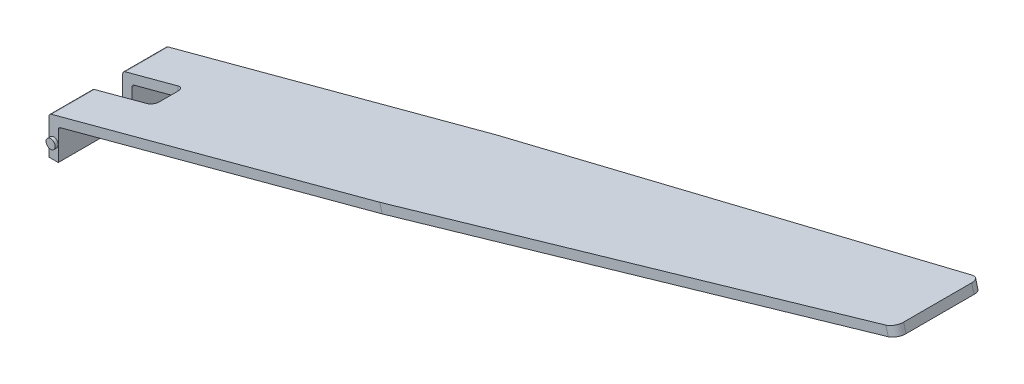
ISO-10303-21;
HEADER;
FILE_DESCRIPTION(('STEP AP214'),'2;1');
FILE_NAME('part.step','',(''),(''),'','','');
FILE_SCHEMA(('AUTOMOTIVE_DESIGN { 1 0 10303 214 1 1 1 1 }'));
ENDSEC;
DATA;
#1=APPLICATION_CONTEXT('core data for automotive mechanical design processes');
#2=APPLICATION_PROTOCOL_DEFINITION('international standard','automotive_design',2000,#1);
#3=PRODUCT_CONTEXT('',#1,'mechanical');
#4=PRODUCT('Part','Part','',(#3));
#5=PRODUCT_RELATED_PRODUCT_CATEGORY('part','',(#4));
#6=PRODUCT_DEFINITION_FORMATION('','',#4);
#7=PRODUCT_DEFINITION_CONTEXT('part definition',#1,'design');
#8=PRODUCT_DEFINITION('design','',#6,#7);
#9=PRODUCT_DEFINITION_SHAPE('','',#8);
#10=(LENGTH_UNIT() NAMED_UNIT(*) SI_UNIT(.MILLI.,.METRE.));
#11=(NAMED_UNIT(*) PLANE_ANGLE_UNIT() SI_UNIT($,.RADIAN.));
#12=(NAMED_UNIT(*) SI_UNIT($,.STERADIAN.) SOLID_ANGLE_UNIT());
#13=UNCERTAINTY_MEASURE_WITH_UNIT(LENGTH_MEASURE(1.E-05),#10,'distance_accuracy_value','');
#14=(GEOMETRIC_REPRESENTATION_CONTEXT(3) GLOBAL_UNCERTAINTY_ASSIGNED_CONTEXT((#13)) GLOBAL_UNIT_ASSIGNED_CONTEXT((#10,
#11,#12)) REPRESENTATION_CONTEXT('',''));
#15=CARTESIAN_POINT('',(0.,0.,0.));
#16=DIRECTION('',(0.,0.,1.));
#17=DIRECTION('',(1.,0.,0.));
#18=AXIS2_PLACEMENT_3D('',#15,#16,#17);
#19=CARTESIAN_POINT('',(0.3,0.,3.8));
#20=DIRECTION('',(0.,1.,0.));
#21=DIRECTION('',(0.,0.,1.));
#22=AXIS2_PLACEMENT_3D('',#19,#20,#21);
#23=PLANE('',#22);
#24=DIRECTION('',(0.,0.,-1.));
#25=VECTOR('',#24,1.);
#26=CARTESIAN_POINT('',(0.,0.,3.8));
#27=LINE('',#26,#25);
#28=CARTESIAN_POINT('',(0.,0.,3.8));
#29=VERTEX_POINT('',#28);
#30=CARTESIAN_POINT('',(0.,0.,2.40000000000001));
#31=VERTEX_POINT('',#30);
#32=EDGE_CURVE('E229',#29,#31,#27,.T.);
#33=ORIENTED_EDGE('',*,*,#32,.T.);
#34=DIRECTION('',(-1.,0.,0.));
#35=VECTOR('',#34,1.);
#36=CARTESIAN_POINT('',(0.,0.,2.40000000000001));
#37=LINE('',#36,#35);
#38=CARTESIAN_POINT('',(0.3,0.,2.40000000000001));
#39=VERTEX_POINT('',#38);
#40=EDGE_CURVE('E222',#39,#31,#37,.T.);
#41=ORIENTED_EDGE('',*,*,#40,.F.);
#42=DIRECTION('',(0.,0.,-1.));
#43=VECTOR('',#42,1.);
#44=CARTESIAN_POINT('',(0.3,0.,3.8));
#45=LINE('',#44,#43);
#46=CARTESIAN_POINT('',(0.3,0.,3.8));
#47=VERTEX_POINT('',#46);
#48=EDGE_CURVE('E249',#47,#39,#45,.T.);
#49=ORIENTED_EDGE('',*,*,#48,.F.);
#50=DIRECTION('',(1.,0.,0.));
#51=VECTOR('',#50,1.);
#52=CARTESIAN_POINT('',(0.3,0.,3.8));
#53=LINE('',#52,#51);
#54=EDGE_CURVE('E419',#29,#47,#53,.T.);
#55=ORIENTED_EDGE('',*,*,#54,.F.);
#56=EDGE_LOOP('',(#33,#41,#49,#55));
#57=FACE_BOUND('',#56,.T.);
#58=ADVANCED_FACE('F39',(#57),#23,.F.);
#59=CARTESIAN_POINT('',(0.3,1.,3.8));
#60=DIRECTION('',(-1.,0.,0.));
#61=DIRECTION('',(0.,-1.,0.));
#62=AXIS2_PLACEMENT_3D('',#59,#60,#61);
#63=PLANE('',#62);
#64=DIRECTION('',(0.,1.,0.));
#65=VECTOR('',#64,1.);
#66=CARTESIAN_POINT('',(0.3,1.,2.40000000000001));
#67=LINE('',#66,#65);
#68=CARTESIAN_POINT('',(0.3,0.923267301202103,2.40000000000001));
#69=VERTEX_POINT('',#68);
#70=EDGE_CURVE('E460',#39,#69,#67,.T.);
#71=ORIENTED_EDGE('',*,*,#70,.T.);
#72=DIRECTION('',(0.,0.,-1.));
#73=VECTOR('',#72,1.);
#74=CARTESIAN_POINT('',(0.3,0.923267301202103,3.8));
#75=LINE('',#74,#73);
#76=CARTESIAN_POINT('',(0.3,0.923267301202103,3.8));
#77=VERTEX_POINT('',#76);
#78=EDGE_CURVE('E321',#69,#77,#75,.F.);
#79=ORIENTED_EDGE('',*,*,#78,.T.);
#80=DIRECTION('',(0.,1.,0.));
#81=VECTOR('',#80,1.);
#82=CARTESIAN_POINT('',(0.3,1.,3.8));
#83=LINE('',#82,#81);
#84=CARTESIAN_POINT('',(0.3,0.5,3.8));
#85=VERTEX_POINT('',#84);
#86=EDGE_CURVE('E423',#85,#77,#83,.T.);
#87=ORIENTED_EDGE('',*,*,#86,.F.);
#88=EDGE_CURVE('E431',#47,#85,#83,.T.);
#89=ORIENTED_EDGE('',*,*,#88,.F.);
#90=ORIENTED_EDGE('',*,*,#48,.T.);
#91=EDGE_LOOP('',(#71,#79,#87,#89,#90));
#92=FACE_BOUND('',#91,.T.);
#93=ADVANCED_FACE('F459',(#92),#63,.F.);
#94=CARTESIAN_POINT('',(0.,0.,3.8));
#95=DIRECTION('',(1.,0.,0.));
#96=DIRECTION('',(0.,0.,-1.));
#97=AXIS2_PLACEMENT_3D('',#94,#95,#96);
#98=PLANE('',#97);
#99=DIRECTION('',(0.,-1.,0.));
#100=VECTOR('',#99,1.);
#101=CARTESIAN_POINT('',(0.,0.,3.8));
#102=LINE('',#101,#100);
#103=CARTESIAN_POINT('',(0.,1.15346539759579,3.8));
#104=VERTEX_POINT('',#103);
#105=CARTESIAN_POINT('',(0.,0.5,3.8));
#106=VERTEX_POINT('',#105);
#107=EDGE_CURVE('E230',#104,#106,#102,.T.);
#108=ORIENTED_EDGE('',*,*,#107,.F.);
#109=DIRECTION('',(0.,0.,-1.));
#110=VECTOR('',#109,1.);
#111=CARTESIAN_POINT('',(0.,1.15346539759579,3.8));
#112=LINE('',#111,#110);
#113=CARTESIAN_POINT('',(0.,1.15346539759579,2.40000000000001));
#114=VERTEX_POINT('',#113);
#115=EDGE_CURVE('E299',#104,#114,#112,.T.);
#116=ORIENTED_EDGE('',*,*,#115,.T.);
#117=DIRECTION('',(0.,-1.,0.));
#118=VECTOR('',#117,1.);
#119=CARTESIAN_POINT('',(0.,0.,2.40000000000001));
#120=LINE('',#119,#118);
#121=EDGE_CURVE('E212',#114,#31,#120,.T.);
#122=ORIENTED_EDGE('',*,*,#121,.T.);
#123=ORIENTED_EDGE('',*,*,#32,.F.);
#124=EDGE_CURVE('E236',#106,#29,#102,.T.);
#125=ORIENTED_EDGE('',*,*,#124,.F.);
#126=EDGE_LOOP('',(#108,#116,#122,#123,#125));
#127=FACE_BOUND('',#126,.T.);
#128=ADVANCED_FACE('F452',(#127),#98,.F.);
#129=CARTESIAN_POINT('',(0.,0.,3.8));
#130=DIRECTION('',(0.,0.,-1.));
#131=DIRECTION('',(-1.,0.,0.));
#132=AXIS2_PLACEMENT_3D('',#129,#130,#131);
#133=PLANE('',#132);
#134=DIRECTION('',(-0.965925826289069,-0.258819045102519,0.));
#135=VECTOR('',#134,1.);
#136=CARTESIAN_POINT('',(0.,1.23019809639369,3.8));
#137=LINE('',#136,#135);
#138=CARTESIAN_POINT('',(10.7732079072745,4.11687045504045,3.8));
#139=VERTEX_POINT('',#138);
#140=CARTESIAN_POINT('',(0.0741180954897481,1.2500579802247,3.8));
#141=VERTEX_POINT('',#140);
#142=EDGE_CURVE('E439',#139,#141,#137,.T.);
#143=ORIENTED_EDGE('',*,*,#142,.T.);
#144=CARTESIAN_POINT('',(0.1,1.15346539759579,3.8));
#145=DIRECTION('',(0.,0.,-1.));
#146=DIRECTION('',(-1.,0.,0.));
#147=AXIS2_PLACEMENT_3D('',#144,#145,#146);
#148=CIRCLE('',#147,0.1);
#149=EDGE_CURVE('E307',#141,#104,#148,.F.);
#150=ORIENTED_EDGE('',*,*,#149,.T.);
#151=ORIENTED_EDGE('',*,*,#107,.T.);
#152=CARTESIAN_POINT('',(0.15,0.5,3.8));
#153=DIRECTION('',(0.,0.,-1.));
#154=DIRECTION('',(-1.,0.,0.));
#155=AXIS2_PLACEMENT_3D('',#152,#153,#154);
#156=CIRCLE('',#155,0.15);
#157=EDGE_CURVE('E401',#106,#85,#156,.T.);
#158=ORIENTED_EDGE('',*,*,#157,.T.);
#159=ORIENTED_EDGE('',*,*,#86,.T.);
#160=CARTESIAN_POINT('',(0.400000000000001,0.923267301202103,3.8));
#161=DIRECTION('',(0.,0.,-1.));
#162=DIRECTION('',(-1.,0.,0.));
#163=AXIS2_PLACEMENT_3D('',#160,#161,#162);
#164=CIRCLE('',#163,0.1);
#165=CARTESIAN_POINT('',(0.374118095489751,1.01985988383101,3.8));
#166=VERTEX_POINT('',#165);
#167=EDGE_CURVE('E334',#77,#166,#164,.T.);
#168=ORIENTED_EDGE('',*,*,#167,.T.);
#169=DIRECTION('',(0.965925826289069,0.258819045102518,0.));
#170=VECTOR('',#169,1.);
#171=CARTESIAN_POINT('',(27.1235688496247,8.18735361137747,3.8));
#172=LINE('',#171,#170);
#173=CARTESIAN_POINT('',(10.8508536208053,3.82709270715373,3.8));
#174=VERTEX_POINT('',#173);
#175=EDGE_CURVE('E436',#166,#174,#172,.T.);
#176=ORIENTED_EDGE('',*,*,#175,.T.);
#177=DIRECTION('',(-0.258819045102522,0.965925826289068,0.));
#178=VECTOR('',#177,1.);
#179=CARTESIAN_POINT('',(11.0807574313729,2.96908000526155,3.8));
#180=LINE('',#179,#178);
#181=EDGE_CURVE('E253',#174,#139,#180,.T.);
#182=ORIENTED_EDGE('',*,*,#181,.T.);
#183=EDGE_LOOP('',(#143,#150,#151,#158,#159,#168,#176,#182));
#184=FACE_BOUND('',#183,.T.);
#185=ADVANCED_FACE('F464',(#184),#133,.F.);
#186=CARTESIAN_POINT('',(0.,0.,0.));
#187=DIRECTION('',(0.,0.,-1.));
#188=DIRECTION('',(-1.,0.,0.));
#189=AXIS2_PLACEMENT_3D('',#186,#187,#188);
#190=PLANE('',#189);
#191=DIRECTION('',(0.,-1.,0.));
#192=VECTOR('',#191,1.);
#193=CARTESIAN_POINT('',(0.,0.,0.));
#194=LINE('',#193,#192);
#195=CARTESIAN_POINT('',(0.,1.15346539759579,0.));
#196=VERTEX_POINT('',#195);
#197=CARTESIAN_POINT('',(0.,0.5,0.));
#198=VERTEX_POINT('',#197);
#199=EDGE_CURVE('E240',#196,#198,#194,.T.);
#200=ORIENTED_EDGE('',*,*,#199,.F.);
#201=CARTESIAN_POINT('',(0.1,1.15346539759579,0.));
#202=DIRECTION('',(0.,0.,-1.));
#203=DIRECTION('',(-1.,0.,0.));
#204=AXIS2_PLACEMENT_3D('',#201,#202,#203);
#205=CIRCLE('',#204,0.1);
#206=CARTESIAN_POINT('',(0.0741180954897481,1.2500579802247,0.));
#207=VERTEX_POINT('',#206);
#208=EDGE_CURVE('E288',#196,#207,#205,.T.);
#209=ORIENTED_EDGE('',*,*,#208,.T.);
#210=DIRECTION('',(-0.965925826289069,-0.258819045102519,0.));
#211=VECTOR('',#210,1.);
#212=CARTESIAN_POINT('',(0.,1.23019809639369,0.));
#213=LINE('',#212,#211);
#214=CARTESIAN_POINT('',(10.7732079072745,4.11687045504045,0.));
#215=VERTEX_POINT('',#214);
#216=EDGE_CURVE('E411',#215,#207,#213,.T.);
#217=ORIENTED_EDGE('',*,*,#216,.F.);
#218=DIRECTION('',(0.258819045102522,-0.965925826289068,0.));
#219=VECTOR('',#218,1.);
#220=CARTESIAN_POINT('',(10.8508536208053,3.82709270715366,0.));
#221=LINE('',#220,#219);
#222=CARTESIAN_POINT('',(10.8508536208053,3.82709270715373,0.));
#223=VERTEX_POINT('',#222);
#224=EDGE_CURVE('E271',#215,#223,#221,.T.);
#225=ORIENTED_EDGE('',*,*,#224,.T.);
#226=DIRECTION('',(0.965925826289069,0.258819045102518,0.));
#227=VECTOR('',#226,1.);
#228=CARTESIAN_POINT('',(27.1235688496247,8.18735361137747,0.));
#229=LINE('',#228,#227);
#230=CARTESIAN_POINT('',(0.374118095489751,1.01985988383101,0.));
#231=VERTEX_POINT('',#230);
#232=EDGE_CURVE('E397',#231,#223,#229,.T.);
#233=ORIENTED_EDGE('',*,*,#232,.F.);
#234=CARTESIAN_POINT('',(0.400000000000001,0.923267301202103,0.));
#235=DIRECTION('',(0.,0.,-1.));
#236=DIRECTION('',(-1.,0.,0.));
#237=AXIS2_PLACEMENT_3D('',#234,#235,#236);
#238=CIRCLE('',#237,0.1);
#239=CARTESIAN_POINT('',(0.3,0.923267301202103,0.));
#240=VERTEX_POINT('',#239);
#241=EDGE_CURVE('E324',#231,#240,#238,.F.);
#242=ORIENTED_EDGE('',*,*,#241,.T.);
#243=DIRECTION('',(0.,1.,0.));
#244=VECTOR('',#243,1.);
#245=CARTESIAN_POINT('',(0.3,1.,0.));
#246=LINE('',#245,#244);
#247=CARTESIAN_POINT('',(0.3,0.5,0.));
#248=VERTEX_POINT('',#247);
#249=EDGE_CURVE('E398',#248,#240,#246,.T.);
#250=ORIENTED_EDGE('',*,*,#249,.F.);
#251=CARTESIAN_POINT('',(0.15,0.5,0.));
#252=DIRECTION('',(0.,0.,-1.));
#253=DIRECTION('',(-1.,0.,0.));
#254=AXIS2_PLACEMENT_3D('',#251,#252,#253);
#255=CIRCLE('',#254,0.15);
#256=EDGE_CURVE('E213',#198,#248,#255,.T.);
#257=ORIENTED_EDGE('',*,*,#256,.F.);
#258=EDGE_LOOP('',(#200,#209,#217,#225,#233,#242,#250,#257));
#259=FACE_BOUND('',#258,.T.);
#260=ADVANCED_FACE('F524',(#259),#190,.T.);
#261=CARTESIAN_POINT('',(0.3,0.,1.4));
#262=VERTEX_POINT('',#261);
#263=CARTESIAN_POINT('',(0.3,0.,0.));
#264=VERTEX_POINT('',#263);
#265=EDGE_CURVE('E220',#262,#264,#45,.T.);
#266=ORIENTED_EDGE('',*,*,#265,.F.);
#267=DIRECTION('',(1.,0.,0.));
#268=VECTOR('',#267,1.);
#269=CARTESIAN_POINT('',(0.,0.,1.4));
#270=LINE('',#269,#268);
#271=CARTESIAN_POINT('',(0.,0.,1.4));
#272=VERTEX_POINT('',#271);
#273=EDGE_CURVE('E203',#272,#262,#270,.T.);
#274=ORIENTED_EDGE('',*,*,#273,.F.);
#275=CARTESIAN_POINT('',(0.,0.,0.));
#276=VERTEX_POINT('',#275);
#277=EDGE_CURVE('E218',#272,#276,#27,.T.);
#278=ORIENTED_EDGE('',*,*,#277,.T.);
#279=DIRECTION('',(1.,0.,0.));
#280=VECTOR('',#279,1.);
#281=CARTESIAN_POINT('',(0.3,0.,0.));
#282=LINE('',#281,#280);
#283=EDGE_CURVE('E394',#276,#264,#282,.T.);
#284=ORIENTED_EDGE('',*,*,#283,.T.);
#285=EDGE_LOOP('',(#266,#274,#278,#284));
#286=FACE_BOUND('',#285,.T.);
#287=ADVANCED_FACE('F216',(#286),#23,.F.);
#288=ORIENTED_EDGE('',*,*,#249,.T.);
#289=DIRECTION('',(0.,0.,-1.));
#290=VECTOR('',#289,1.);
#291=CARTESIAN_POINT('',(0.3,0.923267301202103,1.4));
#292=LINE('',#291,#290);
#293=CARTESIAN_POINT('',(0.3,0.923267301202103,1.4));
#294=VERTEX_POINT('',#293);
#295=EDGE_CURVE('E318',#240,#294,#292,.F.);
#296=ORIENTED_EDGE('',*,*,#295,.T.);
#297=DIRECTION('',(0.,-1.,0.));
#298=VECTOR('',#297,1.);
#299=CARTESIAN_POINT('',(0.3,1.,1.4));
#300=LINE('',#299,#298);
#301=EDGE_CURVE('E391',#294,#262,#300,.T.);
#302=ORIENTED_EDGE('',*,*,#301,.T.);
#303=ORIENTED_EDGE('',*,*,#265,.T.);
#304=EDGE_CURVE('E390',#264,#248,#246,.T.);
#305=ORIENTED_EDGE('',*,*,#304,.T.);
#306=EDGE_LOOP('',(#288,#296,#302,#303,#305));
#307=FACE_BOUND('',#306,.T.);
#308=ADVANCED_FACE('F389',(#307),#63,.F.);
#309=CARTESIAN_POINT('',(27.1235688496247,8.18735361137747,3.8));
#310=DIRECTION('',(-0.258819045102518,0.965925826289069,0.));
#311=DIRECTION('',(-0.965925826289069,-0.258819045102518,0.));
#312=AXIS2_PLACEMENT_3D('',#309,#310,#311);
#313=PLANE('',#312);
#314=DIRECTION('',(0.965500683811202,0.258705128518906,0.0296662440851074));
#315=VECTOR('',#314,1.);
#316=CARTESIAN_POINT('',(27.1235688496247,8.18735361137747,0.5));
#317=LINE('',#316,#315);
#318=CARTESIAN_POINT('',(26.8423877191372,8.11201135453648,0.491360349931353));
#319=VERTEX_POINT('',#318);
#320=EDGE_CURVE('E264',#223,#319,#317,.T.);
#321=ORIENTED_EDGE('',*,*,#320,.T.);
#322=CARTESIAN_POINT('',(26.833791101738,8.10970789784672,0.791228307967168));
#323=DIRECTION('',(-0.258819045102518,0.965925826289069,0.));
#324=DIRECTION('',(-0.965925826289069,-0.258819045102518,0.));
#325=AXIS2_PLACEMENT_3D('',#322,#323,#324);
#326=CIRCLE('',#325,0.3);
#327=CARTESIAN_POINT('',(27.1235688496247,8.18735361137747,0.791228307967169));
#328=VERTEX_POINT('',#327);
#329=EDGE_CURVE('E357',#319,#328,#326,.F.);
#330=ORIENTED_EDGE('',*,*,#329,.T.);
#331=DIRECTION('',(0.,0.,-1.));
#332=VECTOR('',#331,1.);
#333=CARTESIAN_POINT('',(27.1235688496247,8.18735361137747,3.8));
#334=LINE('',#333,#332);
#335=CARTESIAN_POINT('',(27.1235688496247,8.18735361137747,3.00877169203283));
#336=VERTEX_POINT('',#335);
#337=EDGE_CURVE('E245',#336,#328,#334,.T.);
#338=ORIENTED_EDGE('',*,*,#337,.F.);
#339=CARTESIAN_POINT('',(26.833791101738,8.10970789784672,3.00877169203283));
#340=DIRECTION('',(-0.258819045102518,0.965925826289069,0.));
#341=DIRECTION('',(-0.965925826289069,-0.258819045102518,0.));
#342=AXIS2_PLACEMENT_3D('',#339,#340,#341);
#343=CIRCLE('',#342,0.3);
#344=CARTESIAN_POINT('',(26.8423877191372,8.11201135453648,3.30863965006865));
#345=VERTEX_POINT('',#344);
#346=EDGE_CURVE('E354',#336,#345,#343,.F.);
#347=ORIENTED_EDGE('',*,*,#346,.T.);
#348=DIRECTION('',(0.965500683811202,0.258705128518906,-0.0296662440851074));
#349=VECTOR('',#348,1.);
#350=CARTESIAN_POINT('',(10.8508536208053,3.82709270715373,3.8));
#351=LINE('',#350,#349);
#352=EDGE_CURVE('E268',#345,#174,#351,.F.);
#353=ORIENTED_EDGE('',*,*,#352,.T.);
#354=ORIENTED_EDGE('',*,*,#175,.F.);
#355=DIRECTION('',(0.,0.,-1.));
#356=VECTOR('',#355,1.);
#357=CARTESIAN_POINT('',(0.374118095489749,1.01985988383101,2.40000000000001));
#358=LINE('',#357,#356);
#359=CARTESIAN_POINT('',(0.374118095489744,1.01985988383101,2.40000000000001));
#360=VERTEX_POINT('',#359);
#361=EDGE_CURVE('E310',#166,#360,#358,.T.);
#362=ORIENTED_EDGE('',*,*,#361,.T.);
#363=DIRECTION('',(0.965925826289069,0.258819045102518,0.));
#364=VECTOR('',#363,1.);
#365=CARTESIAN_POINT('',(27.1235688496247,8.18735361137747,2.39999999999993));
#366=LINE('',#365,#364);
#367=CARTESIAN_POINT('',(1.8,1.40192378864668,2.4));
#368=VERTEX_POINT('',#367);
#369=EDGE_CURVE('E473',#360,#368,#366,.T.);
#370=ORIENTED_EDGE('',*,*,#369,.T.);
#371=CARTESIAN_POINT('',(1.8,1.40192378864668,2.2));
#372=DIRECTION('',(-0.258819045102518,0.965925826289069,0.));
#373=DIRECTION('',(0.965925826289069,0.258819045102518,0.));
#374=AXIS2_PLACEMENT_3D('',#371,#372,#373);
#375=ELLIPSE('',#374,0.207055236082016,0.2);
#376=CARTESIAN_POINT('',(2.,1.4555136271329,2.2));
#377=VERTEX_POINT('',#376);
#378=EDGE_CURVE('E376',#368,#377,#375,.T.);
#379=ORIENTED_EDGE('',*,*,#378,.T.);
#380=DIRECTION('',(0.,0.,-1.));
#381=VECTOR('',#380,1.);
#382=CARTESIAN_POINT('',(2.,1.4555136271329,3.80000000000002));
#383=LINE('',#382,#381);
#384=CARTESIAN_POINT('',(2.,1.4555136271329,1.6));
#385=VERTEX_POINT('',#384);
#386=EDGE_CURVE('E483',#377,#385,#383,.T.);
#387=ORIENTED_EDGE('',*,*,#386,.T.);
#388=CARTESIAN_POINT('',(1.8,1.40192378864668,1.6));
#389=DIRECTION('',(-0.258819045102518,0.965925826289069,0.));
#390=DIRECTION('',(0.965925826289069,0.258819045102518,0.));
#391=AXIS2_PLACEMENT_3D('',#388,#389,#390);
#392=ELLIPSE('',#391,0.207055236082016,0.2);
#393=CARTESIAN_POINT('',(1.8,1.40192378864668,1.4));
#394=VERTEX_POINT('',#393);
#395=EDGE_CURVE('E48',#385,#394,#392,.T.);
#396=ORIENTED_EDGE('',*,*,#395,.T.);
#397=DIRECTION('',(-0.965925826289069,-0.258819045102518,0.));
#398=VECTOR('',#397,1.);
#399=CARTESIAN_POINT('',(27.1235688496247,8.18735361137747,1.40000000000002));
#400=LINE('',#399,#398);
#401=CARTESIAN_POINT('',(0.374118095489744,1.01985988383101,1.4));
#402=VERTEX_POINT('',#401);
#403=EDGE_CURVE('E746',#394,#402,#400,.T.);
#404=ORIENTED_EDGE('',*,*,#403,.T.);
#405=DIRECTION('',(0.,0.,-1.));
#406=VECTOR('',#405,1.);
#407=CARTESIAN_POINT('',(0.374118095489749,1.01985988383101,0.));
#408=LINE('',#407,#406);
#409=EDGE_CURVE('E314',#402,#231,#408,.T.);
#410=ORIENTED_EDGE('',*,*,#409,.T.);
#411=ORIENTED_EDGE('',*,*,#232,.T.);
#412=EDGE_LOOP('',(#321,#330,#338,#347,#353,#354,#362,#370,#379,#387,#396,#404,#410,#411));
#413=FACE_BOUND('',#412,.T.);
#414=ADVANCED_FACE('F472',(#413),#313,.F.);
#415=CARTESIAN_POINT('',(27.0459231360939,8.47713135926421,3.8));
#416=DIRECTION('',(-0.965925826289068,-0.258819045102522,0.));
#417=DIRECTION('',(0.258819045102522,-0.965925826289068,0.));
#418=AXIS2_PLACEMENT_3D('',#415,#416,#417);
#419=PLANE('',#418);
#420=ORIENTED_EDGE('',*,*,#337,.T.);
#421=DIRECTION('',(-0.258819045102522,0.965925826289068,0.));
#422=VECTOR('',#421,1.);
#423=CARTESIAN_POINT('',(27.0459231360939,8.47713135926421,0.791228307967168));
#424=LINE('',#423,#422);
#425=CARTESIAN_POINT('',(27.0459231360939,8.47713135926421,0.791228307967169));
#426=VERTEX_POINT('',#425);
#427=EDGE_CURVE('E341',#328,#426,#424,.T.);
#428=ORIENTED_EDGE('',*,*,#427,.T.);
#429=DIRECTION('',(0.,0.,-1.));
#430=VECTOR('',#429,1.);
#431=CARTESIAN_POINT('',(27.0459231360939,8.47713135926421,3.8));
#432=LINE('',#431,#430);
#433=CARTESIAN_POINT('',(27.0459231360939,8.47713135926421,3.00877169203283));
#434=VERTEX_POINT('',#433);
#435=EDGE_CURVE('E235',#434,#426,#432,.T.);
#436=ORIENTED_EDGE('',*,*,#435,.F.);
#437=DIRECTION('',(-0.258819045102522,0.965925826289068,0.));
#438=VECTOR('',#437,1.);
#439=CARTESIAN_POINT('',(27.1235688496247,8.18735361137747,3.00877169203283));
#440=LINE('',#439,#438);
#441=EDGE_CURVE('E337',#434,#336,#440,.F.);
#442=ORIENTED_EDGE('',*,*,#441,.T.);
#443=EDGE_LOOP('',(#420,#428,#436,#442));
#444=FACE_BOUND('',#443,.T.);
#445=ADVANCED_FACE('F549',(#444),#419,.F.);
#446=CARTESIAN_POINT('',(0.,1.23019809639369,3.8));
#447=DIRECTION('',(0.258819045102519,-0.965925826289069,0.));
#448=DIRECTION('',(0.965925826289069,0.258819045102519,0.));
#449=AXIS2_PLACEMENT_3D('',#446,#447,#448);
#450=PLANE('',#449);
#451=ORIENTED_EDGE('',*,*,#435,.T.);
#452=CARTESIAN_POINT('',(26.7561453882072,8.39948564573345,0.791228307967168));
#453=DIRECTION('',(0.258819045102519,-0.965925826289069,0.));
#454=DIRECTION('',(0.965925826289069,0.258819045102519,0.));
#455=AXIS2_PLACEMENT_3D('',#452,#453,#454);
#456=CIRCLE('',#455,0.3);
#457=CARTESIAN_POINT('',(26.7647420056065,8.40178910242322,0.491360349931353));
#458=VERTEX_POINT('',#457);
#459=EDGE_CURVE('E348',#426,#458,#456,.F.);
#460=ORIENTED_EDGE('',*,*,#459,.T.);
#461=DIRECTION('',(-0.965500683811202,-0.258705128518906,-0.0296662440851074));
#462=VECTOR('',#461,1.);
#463=CARTESIAN_POINT('',(27.0459231360939,8.47713135926421,0.5));
#464=LINE('',#463,#462);
#465=EDGE_CURVE('E257',#458,#215,#464,.T.);
#466=ORIENTED_EDGE('',*,*,#465,.T.);
#467=ORIENTED_EDGE('',*,*,#216,.T.);
#468=DIRECTION('',(0.,0.,-1.));
#469=VECTOR('',#468,1.);
#470=CARTESIAN_POINT('',(0.0741180954897481,1.2500579802247,3.8));
#471=LINE('',#470,#469);
#472=CARTESIAN_POINT('',(0.0741180954897482,1.2500579802247,1.4));
#473=VERTEX_POINT('',#472);
#474=EDGE_CURVE('E294',#207,#473,#471,.F.);
#475=ORIENTED_EDGE('',*,*,#474,.T.);
#476=DIRECTION('',(0.965925826289069,0.258819045102519,0.));
#477=VECTOR('',#476,1.);
#478=CARTESIAN_POINT('',(0.,1.23019809639369,1.4));
#479=LINE('',#478,#477);
#480=CARTESIAN_POINT('',(1.8,1.7125066427697,1.4));
#481=VERTEX_POINT('',#480);
#482=EDGE_CURVE('E725',#473,#481,#479,.T.);
#483=ORIENTED_EDGE('',*,*,#482,.T.);
#484=CARTESIAN_POINT('',(1.8,1.7125066427697,1.6));
#485=DIRECTION('',(0.258819045102519,-0.965925826289069,0.));
#486=DIRECTION('',(0.965925826289069,0.258819045102519,0.));
#487=AXIS2_PLACEMENT_3D('',#484,#485,#486);
#488=ELLIPSE('',#487,0.207055236082017,0.2);
#489=CARTESIAN_POINT('',(2.,1.76609648125593,1.6));
#490=VERTEX_POINT('',#489);
#491=EDGE_CURVE('E11',#481,#490,#488,.T.);
#492=ORIENTED_EDGE('',*,*,#491,.T.);
#493=DIRECTION('',(0.,0.,1.));
#494=VECTOR('',#493,1.);
#495=CARTESIAN_POINT('',(2.,1.76609648125593,3.8));
#496=LINE('',#495,#494);
#497=CARTESIAN_POINT('',(2.,1.76609648125593,2.2));
#498=VERTEX_POINT('',#497);
#499=EDGE_CURVE('E281',#490,#498,#496,.T.);
#500=ORIENTED_EDGE('',*,*,#499,.T.);
#501=CARTESIAN_POINT('',(1.8,1.7125066427697,2.2));
#502=DIRECTION('',(0.258819045102519,-0.965925826289069,0.));
#503=DIRECTION('',(0.965925826289069,0.258819045102519,0.));
#504=AXIS2_PLACEMENT_3D('',#501,#502,#503);
#505=ELLIPSE('',#504,0.207055236082017,0.2);
#506=CARTESIAN_POINT('',(1.8,1.71250664276971,2.4));
#507=VERTEX_POINT('',#506);
#508=EDGE_CURVE('E379',#498,#507,#505,.T.);
#509=ORIENTED_EDGE('',*,*,#508,.T.);
#510=DIRECTION('',(-0.965925826289069,-0.258819045102519,0.));
#511=VECTOR('',#510,1.);
#512=CARTESIAN_POINT('',(0.,1.23019809639369,2.40000000000001));
#513=LINE('',#512,#511);
#514=CARTESIAN_POINT('',(0.0741180954897482,1.2500579802247,2.40000000000001));
#515=VERTEX_POINT('',#514);
#516=EDGE_CURVE('E479',#507,#515,#513,.T.);
#517=ORIENTED_EDGE('',*,*,#516,.T.);
#518=DIRECTION('',(0.,0.,-1.));
#519=VECTOR('',#518,1.);
#520=CARTESIAN_POINT('',(0.0741180954897481,1.2500579802247,3.8));
#521=LINE('',#520,#519);
#522=EDGE_CURVE('E291',#515,#141,#521,.F.);
#523=ORIENTED_EDGE('',*,*,#522,.T.);
#524=ORIENTED_EDGE('',*,*,#142,.F.);
#525=DIRECTION('',(-0.965500683811202,-0.258705128518906,0.0296662440851074));
#526=VECTOR('',#525,1.);
#527=CARTESIAN_POINT('',(10.7732079072745,4.11687045504045,3.8));
#528=LINE('',#527,#526);
#529=CARTESIAN_POINT('',(26.7647420056065,8.40178910242322,3.30863965006865));
#530=VERTEX_POINT('',#529);
#531=EDGE_CURVE('E260',#139,#530,#528,.F.);
#532=ORIENTED_EDGE('',*,*,#531,.T.);
#533=CARTESIAN_POINT('',(26.7561453882072,8.39948564573345,3.00877169203283));
#534=DIRECTION('',(0.258819045102519,-0.965925826289069,0.));
#535=DIRECTION('',(0.965925826289069,0.258819045102519,0.));
#536=AXIS2_PLACEMENT_3D('',#533,#534,#535);
#537=CIRCLE('',#536,0.3);
#538=EDGE_CURVE('E345',#530,#434,#537,.F.);
#539=ORIENTED_EDGE('',*,*,#538,.T.);
#540=EDGE_LOOP('',(#451,#460,#466,#467,#475,#483,#492,#500,#509,#517,#523,#524,#532,#539));
#541=FACE_BOUND('',#540,.T.);
#542=ADVANCED_FACE('F545',(#541),#450,.F.);
#543=DIRECTION('',(0.,1.,0.));
#544=VECTOR('',#543,1.);
#545=CARTESIAN_POINT('',(0.,0.,1.4));
#546=LINE('',#545,#544);
#547=CARTESIAN_POINT('',(0.,1.15346539759579,1.4));
#548=VERTEX_POINT('',#547);
#549=EDGE_CURVE('E199',#272,#548,#546,.T.);
#550=ORIENTED_EDGE('',*,*,#549,.T.);
#551=DIRECTION('',(0.,0.,-1.));
#552=VECTOR('',#551,1.);
#553=CARTESIAN_POINT('',(0.,1.15346539759579,3.8));
#554=LINE('',#553,#552);
#555=EDGE_CURVE('E285',#548,#196,#554,.T.);
#556=ORIENTED_EDGE('',*,*,#555,.T.);
#557=ORIENTED_EDGE('',*,*,#199,.T.);
#558=EDGE_CURVE('E226',#198,#276,#194,.T.);
#559=ORIENTED_EDGE('',*,*,#558,.T.);
#560=ORIENTED_EDGE('',*,*,#277,.F.);
#561=EDGE_LOOP('',(#550,#556,#557,#559,#560));
#562=FACE_BOUND('',#561,.T.);
#563=ADVANCED_FACE('F224',(#562),#98,.F.);
#564=ORIENTED_EDGE('',*,*,#88,.T.);
#565=EDGE_CURVE('E406',#85,#106,#156,.T.);
#566=ORIENTED_EDGE('',*,*,#565,.T.);
#567=ORIENTED_EDGE('',*,*,#124,.T.);
#568=ORIENTED_EDGE('',*,*,#54,.T.);
#569=EDGE_LOOP('',(#564,#566,#567,#568));
#570=FACE_BOUND('',#569,.T.);
#571=ADVANCED_FACE('F449',(#570),#133,.F.);
#572=EDGE_CURVE('E275',#248,#198,#255,.T.);
#573=ORIENTED_EDGE('',*,*,#572,.F.);
#574=ORIENTED_EDGE('',*,*,#304,.F.);
#575=ORIENTED_EDGE('',*,*,#283,.F.);
#576=ORIENTED_EDGE('',*,*,#558,.F.);
#577=EDGE_LOOP('',(#573,#574,#575,#576));
#578=FACE_BOUND('',#577,.T.);
#579=ADVANCED_FACE('F393',(#578),#190,.T.);
#580=CARTESIAN_POINT('',(11.0807574313729,2.96908000526155,3.8));
#581=DIRECTION('',(-0.0286553913308005,-0.00767818896588583,-0.999559860119384));
#582=DIRECTION('',(-0.258819045102522,0.965925826289068,0.));
#583=AXIS2_PLACEMENT_3D('',#580,#581,#582);
#584=PLANE('',#583);
#585=ORIENTED_EDGE('',*,*,#352,.F.);
#586=DIRECTION('',(0.258819045102522,-0.965925826289068,0.));
#587=VECTOR('',#586,1.);
#588=CARTESIAN_POINT('',(26.7647420056065,8.40178910242322,3.30863965006865));
#589=LINE('',#588,#587);
#590=EDGE_CURVE('E360',#345,#530,#589,.F.);
#591=ORIENTED_EDGE('',*,*,#590,.T.);
#592=ORIENTED_EDGE('',*,*,#531,.F.);
#593=ORIENTED_EDGE('',*,*,#181,.F.);
#594=EDGE_LOOP('',(#585,#591,#592,#593));
#595=FACE_BOUND('',#594,.T.);
#596=ADVANCED_FACE('F512',(#595),#584,.F.);
#597=CARTESIAN_POINT('',(27.0459231360939,8.47713135926421,0.5));
#598=DIRECTION('',(0.0286553913308005,0.00767818896588583,-0.999559860119384));
#599=DIRECTION('',(0.258819045102522,-0.965925826289068,0.));
#600=AXIS2_PLACEMENT_3D('',#597,#598,#599);
#601=PLANE('',#600);
#602=ORIENTED_EDGE('',*,*,#465,.F.);
#603=DIRECTION('',(-0.258819045102522,0.965925826289068,0.));
#604=VECTOR('',#603,1.);
#605=CARTESIAN_POINT('',(26.8423877191372,8.11201135453648,0.491360349931353));
#606=LINE('',#605,#604);
#607=EDGE_CURVE('E351',#458,#319,#606,.F.);
#608=ORIENTED_EDGE('',*,*,#607,.T.);
#609=ORIENTED_EDGE('',*,*,#320,.F.);
#610=ORIENTED_EDGE('',*,*,#224,.F.);
#611=EDGE_LOOP('',(#602,#608,#609,#610));
#612=FACE_BOUND('',#611,.T.);
#613=ADVANCED_FACE('F503',(#612),#601,.T.);
#614=CARTESIAN_POINT('',(0.15,0.5,-0.0999999999999998));
#615=DIRECTION('',(0.,0.,1.));
#616=DIRECTION('',(1.,0.,0.));
#617=AXIS2_PLACEMENT_3D('',#614,#615,#616);
#618=PLANE('',#617);
#619=CARTESIAN_POINT('',(0.15,0.5,-0.0999999999999998));
#620=DIRECTION('',(0.,0.,1.));
#621=DIRECTION('',(1.,0.,0.));
#622=AXIS2_PLACEMENT_3D('',#619,#620,#621);
#623=CIRCLE('',#622,0.15);
#624=CARTESIAN_POINT('',(0.3,0.5,-0.0999999999999998));
#625=VERTEX_POINT('',#624);
#626=EDGE_CURVE('E493',#625,#625,#623,.T.);
#627=ORIENTED_EDGE('',*,*,#626,.F.);
#628=EDGE_LOOP('',(#627));
#629=FACE_BOUND('',#628,.T.);
#630=ADVANCED_FACE('F501',(#629),#618,.F.);
#631=CARTESIAN_POINT('',(0.15,0.5,-0.0999999999999998));
#632=DIRECTION('',(0.,0.,1.));
#633=DIRECTION('',(1.,0.,0.));
#634=AXIS2_PLACEMENT_3D('',#631,#632,#633);
#635=CYLINDRICAL_SURFACE('',#634,0.15);
#636=ORIENTED_EDGE('',*,*,#572,.T.);
#637=ORIENTED_EDGE('',*,*,#256,.T.);
#638=EDGE_LOOP('',(#636,#637));
#639=FACE_BOUND('',#638,.T.);
#640=ORIENTED_EDGE('',*,*,#626,.T.);
#641=EDGE_LOOP('',(#640));
#642=FACE_BOUND('',#641,.T.);
#643=ADVANCED_FACE('F499',(#639,#642),#635,.T.);
#644=CARTESIAN_POINT('',(0.15,0.5,3.9));
#645=DIRECTION('',(0.,0.,1.));
#646=DIRECTION('',(1.,0.,0.));
#647=AXIS2_PLACEMENT_3D('',#644,#645,#646);
#648=CIRCLE('',#647,0.15);
#649=CARTESIAN_POINT('',(0.3,0.5,3.9));
#650=VERTEX_POINT('',#649);
#651=EDGE_CURVE('E490',#650,#650,#648,.T.);
#652=ORIENTED_EDGE('',*,*,#651,.F.);
#653=EDGE_LOOP('',(#652));
#654=FACE_BOUND('',#653,.T.);
#655=ORIENTED_EDGE('',*,*,#157,.F.);
#656=ORIENTED_EDGE('',*,*,#565,.F.);
#657=EDGE_LOOP('',(#655,#656));
#658=FACE_BOUND('',#657,.T.);
#659=ADVANCED_FACE('F509',(#654,#658),#635,.T.);
#660=CARTESIAN_POINT('',(0.15,0.5,3.9));
#661=DIRECTION('',(0.,0.,1.));
#662=DIRECTION('',(1.,0.,0.));
#663=AXIS2_PLACEMENT_3D('',#660,#661,#662);
#664=PLANE('',#663);
#665=ORIENTED_EDGE('',*,*,#651,.T.);
#666=EDGE_LOOP('',(#665));
#667=FACE_BOUND('',#666,.T.);
#668=ADVANCED_FACE('F686',(#667),#664,.T.);
#669=CARTESIAN_POINT('',(2.,10.,2.4));
#670=DIRECTION('',(1.,0.,0.));
#671=DIRECTION('',(0.,0.,-1.));
#672=AXIS2_PLACEMENT_3D('',#669,#670,#671);
#673=PLANE('',#672);
#674=ORIENTED_EDGE('',*,*,#386,.F.);
#675=DIRECTION('',(0.,-1.,0.));
#676=VECTOR('',#675,1.);
#677=CARTESIAN_POINT('',(2.,1.76609648125593,2.2));
#678=LINE('',#677,#676);
#679=EDGE_CURVE('E371',#377,#498,#678,.F.);
#680=ORIENTED_EDGE('',*,*,#679,.T.);
#681=ORIENTED_EDGE('',*,*,#499,.F.);
#682=DIRECTION('',(0.,-1.,0.));
#683=VECTOR('',#682,1.);
#684=CARTESIAN_POINT('',(2.,1.4555136271329,1.6));
#685=LINE('',#684,#683);
#686=EDGE_CURVE('E367',#490,#385,#685,.T.);
#687=ORIENTED_EDGE('',*,*,#686,.T.);
#688=EDGE_LOOP('',(#674,#680,#681,#687));
#689=FACE_BOUND('',#688,.T.);
#690=ADVANCED_FACE('F681',(#689),#673,.F.);
#691=CARTESIAN_POINT('',(0.,10.,2.40000000000001));
#692=DIRECTION('',(0.,0.,1.));
#693=DIRECTION('',(1.,0.,0.));
#694=AXIS2_PLACEMENT_3D('',#691,#692,#693);
#695=PLANE('',#694);
#696=ORIENTED_EDGE('',*,*,#516,.F.);
#697=DIRECTION('',(0.,-1.,0.));
#698=VECTOR('',#697,1.);
#699=CARTESIAN_POINT('',(1.8,1.4555136271329,2.4));
#700=LINE('',#699,#698);
#701=EDGE_CURVE('E363',#507,#368,#700,.T.);
#702=ORIENTED_EDGE('',*,*,#701,.T.);
#703=ORIENTED_EDGE('',*,*,#369,.F.);
#704=CARTESIAN_POINT('',(0.400000000000001,0.923267301202103,2.40000000000001));
#705=DIRECTION('',(0.,0.,1.));
#706=DIRECTION('',(1.,0.,0.));
#707=AXIS2_PLACEMENT_3D('',#704,#705,#706);
#708=CIRCLE('',#707,0.1);
#709=EDGE_CURVE('E331',#360,#69,#708,.T.);
#710=ORIENTED_EDGE('',*,*,#709,.T.);
#711=ORIENTED_EDGE('',*,*,#70,.F.);
#712=ORIENTED_EDGE('',*,*,#40,.T.);
#713=ORIENTED_EDGE('',*,*,#121,.F.);
#714=CARTESIAN_POINT('',(0.1,1.15346539759579,2.40000000000001));
#715=DIRECTION('',(0.,0.,1.));
#716=DIRECTION('',(1.,0.,0.));
#717=AXIS2_PLACEMENT_3D('',#714,#715,#716);
#718=CIRCLE('',#717,0.1);
#719=EDGE_CURVE('E303',#114,#515,#718,.F.);
#720=ORIENTED_EDGE('',*,*,#719,.T.);
#721=EDGE_LOOP('',(#696,#702,#703,#710,#711,#712,#713,#720));
#722=FACE_BOUND('',#721,.T.);
#723=ADVANCED_FACE('F476',(#722),#695,.F.);
#724=CARTESIAN_POINT('',(0.,10.,1.4));
#725=DIRECTION('',(0.,0.,-1.));
#726=DIRECTION('',(-1.,0.,0.));
#727=AXIS2_PLACEMENT_3D('',#724,#725,#726);
#728=PLANE('',#727);
#729=ORIENTED_EDGE('',*,*,#403,.F.);
#730=DIRECTION('',(0.,-1.,0.));
#731=VECTOR('',#730,1.);
#732=CARTESIAN_POINT('',(1.8,1.76609648125593,1.4));
#733=LINE('',#732,#731);
#734=EDGE_CURVE('E61',#394,#481,#733,.F.);
#735=ORIENTED_EDGE('',*,*,#734,.T.);
#736=ORIENTED_EDGE('',*,*,#482,.F.);
#737=CARTESIAN_POINT('',(0.1,1.15346539759579,1.4));
#738=DIRECTION('',(0.,0.,-1.));
#739=DIRECTION('',(-1.,0.,0.));
#740=AXIS2_PLACEMENT_3D('',#737,#738,#739);
#741=CIRCLE('',#740,0.1);
#742=EDGE_CURVE('E206',#473,#548,#741,.F.);
#743=ORIENTED_EDGE('',*,*,#742,.T.);
#744=ORIENTED_EDGE('',*,*,#549,.F.);
#745=ORIENTED_EDGE('',*,*,#273,.T.);
#746=ORIENTED_EDGE('',*,*,#301,.F.);
#747=CARTESIAN_POINT('',(0.400000000000001,0.923267301202103,1.4));
#748=DIRECTION('',(0.,0.,-1.));
#749=DIRECTION('',(-1.,0.,0.));
#750=AXIS2_PLACEMENT_3D('',#747,#748,#749);
#751=CIRCLE('',#750,0.1);
#752=EDGE_CURVE('E327',#294,#402,#751,.T.);
#753=ORIENTED_EDGE('',*,*,#752,.T.);
#754=EDGE_LOOP('',(#729,#735,#736,#743,#744,#745,#746,#753));
#755=FACE_BOUND('',#754,.T.);
#756=ADVANCED_FACE('F201',(#755),#728,.F.);
#757=CARTESIAN_POINT('',(0.1,1.15346539759579,3.8));
#758=DIRECTION('',(0.,0.,-1.));
#759=DIRECTION('',(-1.,0.,0.));
#760=AXIS2_PLACEMENT_3D('',#757,#758,#759);
#761=CYLINDRICAL_SURFACE('',#760,0.1);
#762=ORIENTED_EDGE('',*,*,#742,.F.);
#763=ORIENTED_EDGE('',*,*,#474,.F.);
#764=ORIENTED_EDGE('',*,*,#208,.F.);
#765=ORIENTED_EDGE('',*,*,#555,.F.);
#766=EDGE_LOOP('',(#762,#763,#764,#765));
#767=FACE_BOUND('',#766,.T.);
#768=ADVANCED_FACE('F586',(#767),#761,.T.);
#769=CARTESIAN_POINT('',(0.1,1.15346539759579,3.8));
#770=DIRECTION('',(0.,0.,-1.));
#771=DIRECTION('',(-1.,0.,0.));
#772=AXIS2_PLACEMENT_3D('',#769,#770,#771);
#773=CYLINDRICAL_SURFACE('',#772,0.1);
#774=ORIENTED_EDGE('',*,*,#149,.F.);
#775=ORIENTED_EDGE('',*,*,#522,.F.);
#776=ORIENTED_EDGE('',*,*,#719,.F.);
#777=ORIENTED_EDGE('',*,*,#115,.F.);
#778=EDGE_LOOP('',(#774,#775,#776,#777));
#779=FACE_BOUND('',#778,.T.);
#780=ADVANCED_FACE('F591',(#779),#773,.T.);
#781=CARTESIAN_POINT('',(0.400000000000001,0.923267301202103,3.8));
#782=DIRECTION('',(0.,0.,1.));
#783=DIRECTION('',(1.,0.,0.));
#784=AXIS2_PLACEMENT_3D('',#781,#782,#783);
#785=CYLINDRICAL_SURFACE('',#784,0.1);
#786=ORIENTED_EDGE('',*,*,#752,.F.);
#787=ORIENTED_EDGE('',*,*,#295,.F.);
#788=ORIENTED_EDGE('',*,*,#241,.F.);
#789=ORIENTED_EDGE('',*,*,#409,.F.);
#790=EDGE_LOOP('',(#786,#787,#788,#789));
#791=FACE_BOUND('',#790,.T.);
#792=ADVANCED_FACE('F603',(#791),#785,.F.);
#793=CARTESIAN_POINT('',(0.400000000000001,0.923267301202103,3.8));
#794=DIRECTION('',(0.,0.,1.));
#795=DIRECTION('',(1.,0.,0.));
#796=AXIS2_PLACEMENT_3D('',#793,#794,#795);
#797=CYLINDRICAL_SURFACE('',#796,0.1);
#798=ORIENTED_EDGE('',*,*,#167,.F.);
#799=ORIENTED_EDGE('',*,*,#78,.F.);
#800=ORIENTED_EDGE('',*,*,#709,.F.);
#801=ORIENTED_EDGE('',*,*,#361,.F.);
#802=EDGE_LOOP('',(#798,#799,#800,#801));
#803=FACE_BOUND('',#802,.T.);
#804=ADVANCED_FACE('F469',(#803),#797,.F.);
#805=CARTESIAN_POINT('',(26.7561453882072,8.39948564573345,0.791228307967168));
#806=DIRECTION('',(0.258819045102522,-0.965925826289068,0.));
#807=DIRECTION('',(0.965925826289068,0.258819045102522,0.));
#808=AXIS2_PLACEMENT_3D('',#805,#806,#807);
#809=CYLINDRICAL_SURFACE('',#808,0.3);
#810=ORIENTED_EDGE('',*,*,#329,.F.);
#811=ORIENTED_EDGE('',*,*,#607,.F.);
#812=ORIENTED_EDGE('',*,*,#459,.F.);
#813=ORIENTED_EDGE('',*,*,#427,.F.);
#814=EDGE_LOOP('',(#810,#811,#812,#813));
#815=FACE_BOUND('',#814,.T.);
#816=ADVANCED_FACE('F622',(#815),#809,.T.);
#817=CARTESIAN_POINT('',(26.7561453882072,8.39948564573345,3.00877169203283));
#818=DIRECTION('',(0.258819045102522,-0.965925826289068,0.));
#819=DIRECTION('',(0.965925826289068,0.258819045102522,0.));
#820=AXIS2_PLACEMENT_3D('',#817,#818,#819);
#821=CYLINDRICAL_SURFACE('',#820,0.3);
#822=ORIENTED_EDGE('',*,*,#538,.F.);
#823=ORIENTED_EDGE('',*,*,#590,.F.);
#824=ORIENTED_EDGE('',*,*,#346,.F.);
#825=ORIENTED_EDGE('',*,*,#441,.F.);
#826=EDGE_LOOP('',(#822,#823,#824,#825));
#827=FACE_BOUND('',#826,.T.);
#828=ADVANCED_FACE('F652',(#827),#821,.T.);
#829=CARTESIAN_POINT('',(1.8,10.,2.2));
#830=DIRECTION('',(0.,1.,0.));
#831=DIRECTION('',(0.,0.,1.));
#832=AXIS2_PLACEMENT_3D('',#829,#830,#831);
#833=CYLINDRICAL_SURFACE('',#832,0.2);
#834=ORIENTED_EDGE('',*,*,#508,.F.);
#835=ORIENTED_EDGE('',*,*,#679,.F.);
#836=ORIENTED_EDGE('',*,*,#378,.F.);
#837=ORIENTED_EDGE('',*,*,#701,.F.);
#838=EDGE_LOOP('',(#834,#835,#836,#837));
#839=FACE_BOUND('',#838,.T.);
#840=ADVANCED_FACE('F662',(#839),#833,.F.);
#841=CARTESIAN_POINT('',(1.8,10.,1.6));
#842=DIRECTION('',(0.,1.,0.));
#843=DIRECTION('',(0.,0.,1.));
#844=AXIS2_PLACEMENT_3D('',#841,#842,#843);
#845=CYLINDRICAL_SURFACE('',#844,0.2);
#846=ORIENTED_EDGE('',*,*,#491,.F.);
#847=ORIENTED_EDGE('',*,*,#734,.F.);
#848=ORIENTED_EDGE('',*,*,#395,.F.);
#849=ORIENTED_EDGE('',*,*,#686,.F.);
#850=EDGE_LOOP('',(#846,#847,#848,#849));
#851=FACE_BOUND('',#850,.T.);
#852=ADVANCED_FACE('F41',(#851),#845,.F.);
#853=CLOSED_SHELL('',(#58,#93,#128,#185,#260,#287,#308,#414,#445,#542,#563,#571,#579,#596,#613,
#630,#643,#659,#668,#690,#723,#756,#768,#780,#792,#804,#816,#828,#840,#852));
#854=MANIFOLD_SOLID_BREP('B2',#853);
#855=ADVANCED_BREP_SHAPE_REPRESENTATION('',(#18,#854),#14);
#856=SHAPE_DEFINITION_REPRESENTATION(#9,#855);
ENDSEC;
END-ISO-10303-21;
